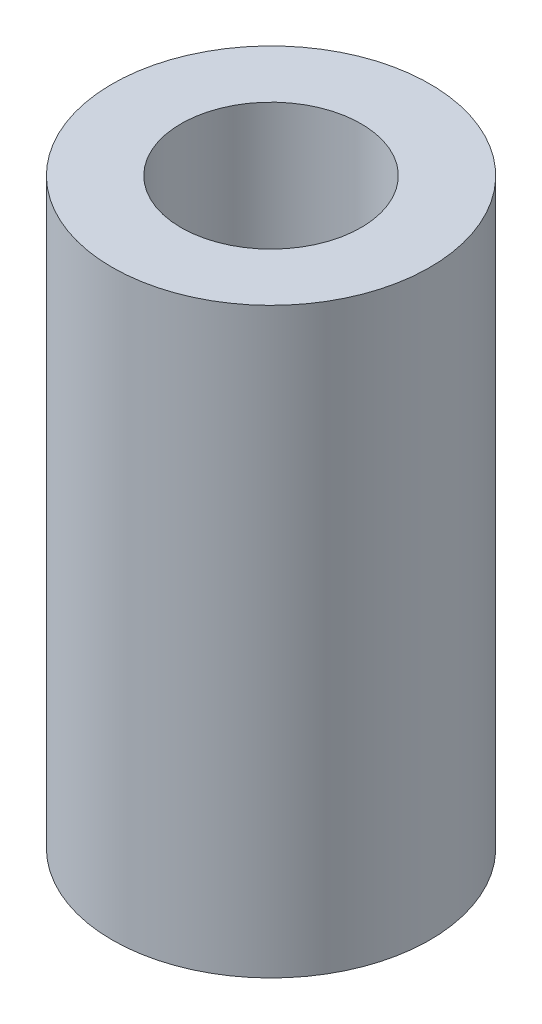
ISO-10303-21;
HEADER;
FILE_DESCRIPTION(('STEP AP214'),'2;1');
FILE_NAME('part.step','',(''),(''),'','','');
FILE_SCHEMA(('AUTOMOTIVE_DESIGN { 1 0 10303 214 1 1 1 1 }'));
ENDSEC;
DATA;
#1=APPLICATION_CONTEXT('core data for automotive mechanical design processes');
#2=APPLICATION_PROTOCOL_DEFINITION('international standard','automotive_design',2000,#1);
#3=PRODUCT_CONTEXT('',#1,'mechanical');
#4=PRODUCT('Part','Part','',(#3));
#5=PRODUCT_RELATED_PRODUCT_CATEGORY('part','',(#4));
#6=PRODUCT_DEFINITION_FORMATION('','',#4);
#7=PRODUCT_DEFINITION_CONTEXT('part definition',#1,'design');
#8=PRODUCT_DEFINITION('design','',#6,#7);
#9=PRODUCT_DEFINITION_SHAPE('','',#8);
#10=(LENGTH_UNIT() NAMED_UNIT(*) SI_UNIT(.MILLI.,.METRE.));
#11=(NAMED_UNIT(*) PLANE_ANGLE_UNIT() SI_UNIT($,.RADIAN.));
#12=(NAMED_UNIT(*) SI_UNIT($,.STERADIAN.) SOLID_ANGLE_UNIT());
#13=UNCERTAINTY_MEASURE_WITH_UNIT(LENGTH_MEASURE(1.E-05),#10,'distance_accuracy_value','');
#14=(GEOMETRIC_REPRESENTATION_CONTEXT(3) GLOBAL_UNCERTAINTY_ASSIGNED_CONTEXT((#13)) GLOBAL_UNIT_ASSIGNED_CONTEXT((#10,
#11,#12)) REPRESENTATION_CONTEXT('',''));
#15=CARTESIAN_POINT('',(0.,0.,0.));
#16=DIRECTION('',(0.,0.,1.));
#17=DIRECTION('',(1.,0.,0.));
#18=AXIS2_PLACEMENT_3D('',#15,#16,#17);
#19=CARTESIAN_POINT('',(0.,5.5,0.));
#20=DIRECTION('',(0.,-1.,0.));
#21=DIRECTION('',(0.,0.,-1.));
#22=AXIS2_PLACEMENT_3D('',#19,#20,#21);
#23=CYLINDRICAL_SURFACE('',#22,3.);
#24=CARTESIAN_POINT('',(0.,5.5,0.));
#25=DIRECTION('',(0.,1.,0.));
#26=DIRECTION('',(0.,0.,1.));
#27=AXIS2_PLACEMENT_3D('',#24,#25,#26);
#28=CIRCLE('',#27,3.);
#29=CARTESIAN_POINT('',(0.,5.5,3.));
#30=VERTEX_POINT('',#29);
#31=EDGE_CURVE('E10',#30,#30,#28,.T.);
#32=ORIENTED_EDGE('',*,*,#31,.F.);
#33=EDGE_LOOP('',(#32));
#34=FACE_BOUND('',#33,.T.);
#35=CARTESIAN_POINT('',(0.,-5.5,0.));
#36=DIRECTION('',(0.,1.,0.));
#37=DIRECTION('',(0.,0.,1.));
#38=AXIS2_PLACEMENT_3D('',#35,#36,#37);
#39=CIRCLE('',#38,3.);
#40=CARTESIAN_POINT('',(0.,-5.5,3.));
#41=VERTEX_POINT('',#40);
#42=EDGE_CURVE('E37',#41,#41,#39,.T.);
#43=ORIENTED_EDGE('',*,*,#42,.T.);
#44=EDGE_LOOP('',(#43));
#45=FACE_BOUND('',#44,.T.);
#46=ADVANCED_FACE('F34',(#34,#45),#23,.T.);
#47=CARTESIAN_POINT('',(0.,5.5,0.));
#48=DIRECTION('',(0.,1.,0.));
#49=DIRECTION('',(0.,0.,1.));
#50=AXIS2_PLACEMENT_3D('',#47,#48,#49);
#51=PLANE('',#50);
#52=CARTESIAN_POINT('',(0.,5.5,0.));
#53=DIRECTION('',(0.,1.,0.));
#54=DIRECTION('',(0.,0.,1.));
#55=AXIS2_PLACEMENT_3D('',#52,#53,#54);
#56=CIRCLE('',#55,1.7);
#57=CARTESIAN_POINT('',(0.,5.5,1.7));
#58=VERTEX_POINT('',#57);
#59=EDGE_CURVE('E48',#58,#58,#56,.T.);
#60=ORIENTED_EDGE('',*,*,#59,.F.);
#61=EDGE_LOOP('',(#60));
#62=FACE_BOUND('',#61,.T.);
#63=ORIENTED_EDGE('',*,*,#31,.T.);
#64=EDGE_LOOP('',(#63));
#65=FACE_BOUND('',#64,.T.);
#66=ADVANCED_FACE('F54',(#62,#65),#51,.T.);
#67=CARTESIAN_POINT('',(0.,-5.5,0.));
#68=DIRECTION('',(0.,1.,0.));
#69=DIRECTION('',(0.,0.,1.));
#70=AXIS2_PLACEMENT_3D('',#67,#68,#69);
#71=PLANE('',#70);
#72=CARTESIAN_POINT('',(0.,-5.5,0.));
#73=DIRECTION('',(0.,1.,0.));
#74=DIRECTION('',(0.,0.,1.));
#75=AXIS2_PLACEMENT_3D('',#72,#73,#74);
#76=CIRCLE('',#75,1.7);
#77=CARTESIAN_POINT('',(0.,-5.5,1.7));
#78=VERTEX_POINT('',#77);
#79=EDGE_CURVE('E44',#78,#78,#76,.T.);
#80=ORIENTED_EDGE('',*,*,#79,.T.);
#81=EDGE_LOOP('',(#80));
#82=FACE_BOUND('',#81,.T.);
#83=ORIENTED_EDGE('',*,*,#42,.F.);
#84=EDGE_LOOP('',(#83));
#85=FACE_BOUND('',#84,.T.);
#86=ADVANCED_FACE('F56',(#82,#85),#71,.F.);
#87=CARTESIAN_POINT('',(0.,5.5,0.));
#88=DIRECTION('',(0.,1.,0.));
#89=DIRECTION('',(0.,0.,1.));
#90=AXIS2_PLACEMENT_3D('',#87,#88,#89);
#91=CYLINDRICAL_SURFACE('',#90,1.7);
#92=ORIENTED_EDGE('',*,*,#79,.F.);
#93=EDGE_LOOP('',(#92));
#94=FACE_BOUND('',#93,.T.);
#95=ORIENTED_EDGE('',*,*,#59,.T.);
#96=EDGE_LOOP('',(#95));
#97=FACE_BOUND('',#96,.T.);
#98=ADVANCED_FACE('F52',(#94,#97),#91,.F.);
#99=CLOSED_SHELL('',(#46,#66,#86,#98));
#100=MANIFOLD_SOLID_BREP('B2',#99);
#101=ADVANCED_BREP_SHAPE_REPRESENTATION('',(#18,#100),#14);
#102=SHAPE_DEFINITION_REPRESENTATION(#9,#101);
ENDSEC;
END-ISO-10303-21;
